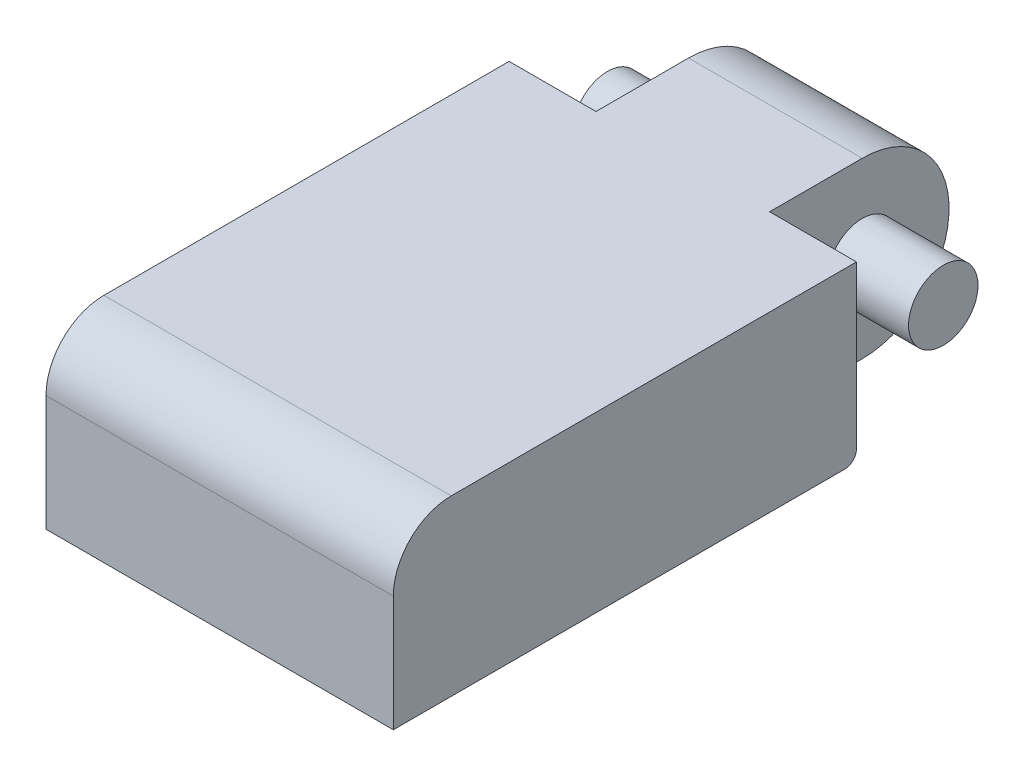
ISO-10303-21;
HEADER;
FILE_DESCRIPTION(('STEP AP214'),'2;1');
FILE_NAME('part.step','',(''),(''),'','','');
FILE_SCHEMA(('AUTOMOTIVE_DESIGN { 1 0 10303 214 1 1 1 1 }'));
ENDSEC;
DATA;
#1=APPLICATION_CONTEXT('core data for automotive mechanical design processes');
#2=APPLICATION_PROTOCOL_DEFINITION('international standard','automotive_design',2000,#1);
#3=PRODUCT_CONTEXT('',#1,'mechanical');
#4=PRODUCT('Part','Part','',(#3));
#5=PRODUCT_RELATED_PRODUCT_CATEGORY('part','',(#4));
#6=PRODUCT_DEFINITION_FORMATION('','',#4);
#7=PRODUCT_DEFINITION_CONTEXT('part definition',#1,'design');
#8=PRODUCT_DEFINITION('design','',#6,#7);
#9=PRODUCT_DEFINITION_SHAPE('','',#8);
#10=(LENGTH_UNIT() NAMED_UNIT(*) SI_UNIT(.MILLI.,.METRE.));
#11=(NAMED_UNIT(*) PLANE_ANGLE_UNIT() SI_UNIT($,.RADIAN.));
#12=(NAMED_UNIT(*) SI_UNIT($,.STERADIAN.) SOLID_ANGLE_UNIT());
#13=UNCERTAINTY_MEASURE_WITH_UNIT(LENGTH_MEASURE(1.E-05),#10,'distance_accuracy_value','');
#14=(GEOMETRIC_REPRESENTATION_CONTEXT(3) GLOBAL_UNCERTAINTY_ASSIGNED_CONTEXT((#13)) GLOBAL_UNIT_ASSIGNED_CONTEXT((#10,
#11,#12)) REPRESENTATION_CONTEXT('',''));
#15=CARTESIAN_POINT('',(0.,0.,0.));
#16=DIRECTION('',(0.,0.,1.));
#17=DIRECTION('',(1.,0.,0.));
#18=AXIS2_PLACEMENT_3D('',#15,#16,#17);
#19=CARTESIAN_POINT('',(0.,0.,0.));
#20=DIRECTION('',(0.,0.,1.));
#21=DIRECTION('',(1.,0.,0.));
#22=AXIS2_PLACEMENT_3D('',#19,#20,#21);
#23=PLANE('',#22);
#24=DIRECTION('',(0.,1.,0.));
#25=VECTOR('',#24,1.);
#26=CARTESIAN_POINT('',(15.,7.5,0.));
#27=LINE('',#26,#25);
#28=CARTESIAN_POINT('',(15.,-6.5,0.));
#29=VERTEX_POINT('',#28);
#30=CARTESIAN_POINT('',(15.,7.5,0.));
#31=VERTEX_POINT('',#30);
#32=EDGE_CURVE('E143',#29,#31,#27,.T.);
#33=ORIENTED_EDGE('',*,*,#32,.F.);
#34=DIRECTION('',(1.,0.,0.));
#35=VECTOR('',#34,1.);
#36=CARTESIAN_POINT('',(0.,-6.5,0.));
#37=LINE('',#36,#35);
#38=CARTESIAN_POINT('',(7.5,-6.5,0.));
#39=VERTEX_POINT('',#38);
#40=EDGE_CURVE('E54',#29,#39,#37,.F.);
#41=ORIENTED_EDGE('',*,*,#40,.T.);
#42=DIRECTION('',(0.,-1.,0.));
#43=VECTOR('',#42,1.);
#44=CARTESIAN_POINT('',(7.5,7.5,0.));
#45=LINE('',#44,#43);
#46=CARTESIAN_POINT('',(7.5,7.5,0.));
#47=VERTEX_POINT('',#46);
#48=EDGE_CURVE('E132',#47,#39,#45,.T.);
#49=ORIENTED_EDGE('',*,*,#48,.F.);
#50=DIRECTION('',(-1.,0.,0.));
#51=VECTOR('',#50,1.);
#52=CARTESIAN_POINT('',(-15.,7.5,0.));
#53=LINE('',#52,#51);
#54=EDGE_CURVE('E187',#31,#47,#53,.T.);
#55=ORIENTED_EDGE('',*,*,#54,.F.);
#56=EDGE_LOOP('',(#33,#41,#49,#55));
#57=FACE_BOUND('',#56,.T.);
#58=ADVANCED_FACE('F38',(#57),#23,.F.);
#59=CARTESIAN_POINT('',(15.,7.5,40.));
#60=DIRECTION('',(-1.,0.,0.));
#61=DIRECTION('',(0.,-1.,0.));
#62=AXIS2_PLACEMENT_3D('',#59,#60,#61);
#63=PLANE('',#62);
#64=DIRECTION('',(0.,0.,-1.));
#65=VECTOR('',#64,1.);
#66=CARTESIAN_POINT('',(15.,-7.5,40.));
#67=LINE('',#66,#65);
#68=CARTESIAN_POINT('',(15.,-7.5,40.));
#69=VERTEX_POINT('',#68);
#70=CARTESIAN_POINT('',(15.,-7.5,1.));
#71=VERTEX_POINT('',#70);
#72=EDGE_CURVE('E183',#69,#71,#67,.T.);
#73=ORIENTED_EDGE('',*,*,#72,.T.);
#74=CARTESIAN_POINT('',(15.,-6.5,1.));
#75=DIRECTION('',(-1.,0.,0.));
#76=DIRECTION('',(0.,-1.,0.));
#77=AXIS2_PLACEMENT_3D('',#74,#75,#76);
#78=CIRCLE('',#77,1.);
#79=EDGE_CURVE('E62',#71,#29,#78,.F.);
#80=ORIENTED_EDGE('',*,*,#79,.T.);
#81=ORIENTED_EDGE('',*,*,#32,.T.);
#82=DIRECTION('',(0.,0.,-1.));
#83=VECTOR('',#82,1.);
#84=CARTESIAN_POINT('',(15.,7.5,40.));
#85=LINE('',#84,#83);
#86=CARTESIAN_POINT('',(15.,7.5,35.));
#87=VERTEX_POINT('',#86);
#88=EDGE_CURVE('E202',#87,#31,#85,.T.);
#89=ORIENTED_EDGE('',*,*,#88,.F.);
#90=CARTESIAN_POINT('',(15.,2.5,35.));
#91=DIRECTION('',(-1.,0.,0.));
#92=DIRECTION('',(0.,-1.,0.));
#93=AXIS2_PLACEMENT_3D('',#90,#91,#92);
#94=CIRCLE('',#93,5.);
#95=CARTESIAN_POINT('',(15.,2.5,40.));
#96=VERTEX_POINT('',#95);
#97=EDGE_CURVE('E224',#87,#96,#94,.F.);
#98=ORIENTED_EDGE('',*,*,#97,.T.);
#99=DIRECTION('',(0.,1.,0.));
#100=VECTOR('',#99,1.);
#101=CARTESIAN_POINT('',(15.,7.5,40.));
#102=LINE('',#101,#100);
#103=EDGE_CURVE('E172',#69,#96,#102,.T.);
#104=ORIENTED_EDGE('',*,*,#103,.F.);
#105=EDGE_LOOP('',(#73,#80,#81,#89,#98,#104));
#106=FACE_BOUND('',#105,.T.);
#107=ADVANCED_FACE('F275',(#106),#63,.F.);
#108=CARTESIAN_POINT('',(-15.,7.5,40.));
#109=DIRECTION('',(0.,-1.,0.));
#110=DIRECTION('',(0.,0.,-1.));
#111=AXIS2_PLACEMENT_3D('',#108,#109,#110);
#112=PLANE('',#111);
#113=DIRECTION('',(0.,0.,-1.));
#114=VECTOR('',#113,1.);
#115=CARTESIAN_POINT('',(-15.,7.5,40.));
#116=LINE('',#115,#114);
#117=CARTESIAN_POINT('',(-15.,7.5,35.));
#118=VERTEX_POINT('',#117);
#119=CARTESIAN_POINT('',(-15.,7.5,0.));
#120=VERTEX_POINT('',#119);
#121=EDGE_CURVE('E199',#118,#120,#116,.T.);
#122=ORIENTED_EDGE('',*,*,#121,.F.);
#123=DIRECTION('',(-1.,0.,0.));
#124=VECTOR('',#123,1.);
#125=CARTESIAN_POINT('',(15.,7.5,35.));
#126=LINE('',#125,#124);
#127=EDGE_CURVE('E221',#118,#87,#126,.F.);
#128=ORIENTED_EDGE('',*,*,#127,.T.);
#129=ORIENTED_EDGE('',*,*,#88,.T.);
#130=ORIENTED_EDGE('',*,*,#54,.T.);
#131=DIRECTION('',(0.,0.,1.));
#132=VECTOR('',#131,1.);
#133=CARTESIAN_POINT('',(7.5,7.5,0.));
#134=LINE('',#133,#132);
#135=CARTESIAN_POINT('',(7.5,7.5,-8.));
#136=VERTEX_POINT('',#135);
#137=EDGE_CURVE('E150',#136,#47,#134,.T.);
#138=ORIENTED_EDGE('',*,*,#137,.F.);
#139=DIRECTION('',(-1.,0.,0.));
#140=VECTOR('',#139,1.);
#141=CARTESIAN_POINT('',(7.5,7.5,-8.));
#142=LINE('',#141,#140);
#143=CARTESIAN_POINT('',(-7.5,7.5,-8.));
#144=VERTEX_POINT('',#143);
#145=EDGE_CURVE('E144',#136,#144,#142,.T.);
#146=ORIENTED_EDGE('',*,*,#145,.T.);
#147=DIRECTION('',(0.,0.,1.));
#148=VECTOR('',#147,1.);
#149=CARTESIAN_POINT('',(-7.5,7.5,0.));
#150=LINE('',#149,#148);
#151=CARTESIAN_POINT('',(-7.5,7.5,0.));
#152=VERTEX_POINT('',#151);
#153=EDGE_CURVE('E166',#144,#152,#150,.T.);
#154=ORIENTED_EDGE('',*,*,#153,.T.);
#155=EDGE_CURVE('E186',#152,#120,#53,.T.);
#156=ORIENTED_EDGE('',*,*,#155,.T.);
#157=EDGE_LOOP('',(#122,#128,#129,#130,#138,#146,#154,#156));
#158=FACE_BOUND('',#157,.T.);
#159=ADVANCED_FACE('F271',(#158),#112,.F.);
#160=CARTESIAN_POINT('',(-15.,7.5,40.));
#161=DIRECTION('',(1.,0.,0.));
#162=DIRECTION('',(0.,1.,0.));
#163=AXIS2_PLACEMENT_3D('',#160,#161,#162);
#164=PLANE('',#163);
#165=DIRECTION('',(0.,-1.,0.));
#166=VECTOR('',#165,1.);
#167=CARTESIAN_POINT('',(-15.,7.5,0.));
#168=LINE('',#167,#166);
#169=CARTESIAN_POINT('',(-15.,-6.5,0.));
#170=VERTEX_POINT('',#169);
#171=EDGE_CURVE('E177',#120,#170,#168,.T.);
#172=ORIENTED_EDGE('',*,*,#171,.T.);
#173=CARTESIAN_POINT('',(-15.,-6.5,1.));
#174=DIRECTION('',(1.,0.,0.));
#175=DIRECTION('',(0.,1.,0.));
#176=AXIS2_PLACEMENT_3D('',#173,#174,#175);
#177=CIRCLE('',#176,1.);
#178=CARTESIAN_POINT('',(-15.,-7.5,1.));
#179=VERTEX_POINT('',#178);
#180=EDGE_CURVE('E236',#170,#179,#177,.F.);
#181=ORIENTED_EDGE('',*,*,#180,.T.);
#182=DIRECTION('',(0.,0.,-1.));
#183=VECTOR('',#182,1.);
#184=CARTESIAN_POINT('',(-15.,-7.5,40.));
#185=LINE('',#184,#183);
#186=CARTESIAN_POINT('',(-15.,-7.5,40.));
#187=VERTEX_POINT('',#186);
#188=EDGE_CURVE('E196',#187,#179,#185,.T.);
#189=ORIENTED_EDGE('',*,*,#188,.F.);
#190=DIRECTION('',(0.,-1.,0.));
#191=VECTOR('',#190,1.);
#192=CARTESIAN_POINT('',(-15.,7.5,40.));
#193=LINE('',#192,#191);
#194=CARTESIAN_POINT('',(-15.,2.5,40.));
#195=VERTEX_POINT('',#194);
#196=EDGE_CURVE('E176',#195,#187,#193,.T.);
#197=ORIENTED_EDGE('',*,*,#196,.F.);
#198=CARTESIAN_POINT('',(-15.,2.5,35.));
#199=DIRECTION('',(1.,0.,0.));
#200=DIRECTION('',(0.,1.,0.));
#201=AXIS2_PLACEMENT_3D('',#198,#199,#200);
#202=CIRCLE('',#201,5.);
#203=EDGE_CURVE('E218',#195,#118,#202,.F.);
#204=ORIENTED_EDGE('',*,*,#203,.T.);
#205=ORIENTED_EDGE('',*,*,#121,.T.);
#206=EDGE_LOOP('',(#172,#181,#189,#197,#204,#205));
#207=FACE_BOUND('',#206,.T.);
#208=ADVANCED_FACE('F259',(#207),#164,.F.);
#209=CARTESIAN_POINT('',(-15.,-7.5,40.));
#210=DIRECTION('',(0.,1.,0.));
#211=DIRECTION('',(0.,0.,1.));
#212=AXIS2_PLACEMENT_3D('',#209,#210,#211);
#213=PLANE('',#212);
#214=ORIENTED_EDGE('',*,*,#188,.T.);
#215=DIRECTION('',(1.,0.,0.));
#216=VECTOR('',#215,1.);
#217=CARTESIAN_POINT('',(-15.,-7.5,1.));
#218=LINE('',#217,#216);
#219=CARTESIAN_POINT('',(-7.5,-7.5,1.));
#220=VERTEX_POINT('',#219);
#221=EDGE_CURVE('E230',#179,#220,#218,.T.);
#222=ORIENTED_EDGE('',*,*,#221,.T.);
#223=DIRECTION('',(0.,0.,-1.));
#224=VECTOR('',#223,1.);
#225=CARTESIAN_POINT('',(-7.5,-7.5,-8.));
#226=LINE('',#225,#224);
#227=CARTESIAN_POINT('',(-7.5,-7.5,-8.));
#228=VERTEX_POINT('',#227);
#229=EDGE_CURVE('E139',#220,#228,#226,.T.);
#230=ORIENTED_EDGE('',*,*,#229,.T.);
#231=DIRECTION('',(-1.,0.,0.));
#232=VECTOR('',#231,1.);
#233=CARTESIAN_POINT('',(7.5,-7.5,-8.));
#234=LINE('',#233,#232);
#235=CARTESIAN_POINT('',(7.5,-7.5,-8.));
#236=VERTEX_POINT('',#235);
#237=EDGE_CURVE('E135',#236,#228,#234,.T.);
#238=ORIENTED_EDGE('',*,*,#237,.F.);
#239=DIRECTION('',(0.,0.,-1.));
#240=VECTOR('',#239,1.);
#241=CARTESIAN_POINT('',(7.5,-7.5,-8.));
#242=LINE('',#241,#240);
#243=CARTESIAN_POINT('',(7.5,-7.5,1.));
#244=VERTEX_POINT('',#243);
#245=EDGE_CURVE('E120',#244,#236,#242,.T.);
#246=ORIENTED_EDGE('',*,*,#245,.F.);
#247=DIRECTION('',(1.,0.,0.));
#248=VECTOR('',#247,1.);
#249=CARTESIAN_POINT('',(-15.,-7.5,1.));
#250=LINE('',#249,#248);
#251=EDGE_CURVE('E227',#244,#71,#250,.T.);
#252=ORIENTED_EDGE('',*,*,#251,.T.);
#253=ORIENTED_EDGE('',*,*,#72,.F.);
#254=DIRECTION('',(1.,0.,0.));
#255=VECTOR('',#254,1.);
#256=CARTESIAN_POINT('',(-15.,-7.5,40.));
#257=LINE('',#256,#255);
#258=EDGE_CURVE('E180',#187,#69,#257,.T.);
#259=ORIENTED_EDGE('',*,*,#258,.F.);
#260=EDGE_LOOP('',(#214,#222,#230,#238,#246,#252,#253,#259));
#261=FACE_BOUND('',#260,.T.);
#262=ADVANCED_FACE('F137',(#261),#213,.F.);
#263=CARTESIAN_POINT('',(0.,0.,40.));
#264=DIRECTION('',(0.,0.,1.));
#265=DIRECTION('',(1.,0.,0.));
#266=AXIS2_PLACEMENT_3D('',#263,#264,#265);
#267=PLANE('',#266);
#268=ORIENTED_EDGE('',*,*,#103,.T.);
#269=DIRECTION('',(-1.,0.,0.));
#270=VECTOR('',#269,1.);
#271=CARTESIAN_POINT('',(-15.,2.5,40.));
#272=LINE('',#271,#270);
#273=EDGE_CURVE('E214',#96,#195,#272,.T.);
#274=ORIENTED_EDGE('',*,*,#273,.T.);
#275=ORIENTED_EDGE('',*,*,#196,.T.);
#276=ORIENTED_EDGE('',*,*,#258,.T.);
#277=EDGE_LOOP('',(#268,#274,#275,#276));
#278=FACE_BOUND('',#277,.T.);
#279=ADVANCED_FACE('F265',(#278),#267,.T.);
#280=DIRECTION('',(0.,-1.,0.));
#281=VECTOR('',#280,1.);
#282=CARTESIAN_POINT('',(-7.5,7.5,0.));
#283=LINE('',#282,#281);
#284=CARTESIAN_POINT('',(-7.5,-6.5,0.));
#285=VERTEX_POINT('',#284);
#286=EDGE_CURVE('E156',#152,#285,#283,.T.);
#287=ORIENTED_EDGE('',*,*,#286,.T.);
#288=DIRECTION('',(1.,0.,0.));
#289=VECTOR('',#288,1.);
#290=CARTESIAN_POINT('',(0.,-6.5,0.));
#291=LINE('',#290,#289);
#292=EDGE_CURVE('E233',#285,#170,#291,.F.);
#293=ORIENTED_EDGE('',*,*,#292,.T.);
#294=ORIENTED_EDGE('',*,*,#171,.F.);
#295=ORIENTED_EDGE('',*,*,#155,.F.);
#296=EDGE_LOOP('',(#287,#293,#294,#295));
#297=FACE_BOUND('',#296,.T.);
#298=ADVANCED_FACE('F252',(#297),#23,.F.);
#299=CARTESIAN_POINT('',(7.5,0.,-8.));
#300=DIRECTION('',(-1.,0.,0.));
#301=DIRECTION('',(0.,0.,1.));
#302=AXIS2_PLACEMENT_3D('',#299,#300,#301);
#303=CYLINDRICAL_SURFACE('',#302,7.5);
#304=CARTESIAN_POINT('',(-7.5,0.,-8.));
#305=DIRECTION('',(1.,0.,0.));
#306=DIRECTION('',(0.,0.,1.));
#307=AXIS2_PLACEMENT_3D('',#304,#305,#306);
#308=CIRCLE('',#307,7.5);
#309=EDGE_CURVE('E163',#228,#144,#308,.T.);
#310=ORIENTED_EDGE('',*,*,#309,.T.);
#311=ORIENTED_EDGE('',*,*,#145,.F.);
#312=CARTESIAN_POINT('',(7.5,0.,-8.));
#313=DIRECTION('',(1.,0.,0.));
#314=DIRECTION('',(0.,0.,1.));
#315=AXIS2_PLACEMENT_3D('',#312,#313,#314);
#316=CIRCLE('',#315,7.5);
#317=EDGE_CURVE('E125',#236,#136,#316,.T.);
#318=ORIENTED_EDGE('',*,*,#317,.F.);
#319=ORIENTED_EDGE('',*,*,#237,.T.);
#320=EDGE_LOOP('',(#310,#311,#318,#319));
#321=FACE_BOUND('',#320,.T.);
#322=ADVANCED_FACE('F146',(#321),#303,.T.);
#323=CARTESIAN_POINT('',(7.5,0.,-8.));
#324=DIRECTION('',(-1.,0.,0.));
#325=DIRECTION('',(0.,0.,1.));
#326=AXIS2_PLACEMENT_3D('',#323,#324,#325);
#327=PLANE('',#326);
#328=CARTESIAN_POINT('',(7.5,0.,-8.));
#329=DIRECTION('',(-1.,0.,0.));
#330=DIRECTION('',(0.,0.,1.));
#331=AXIS2_PLACEMENT_3D('',#328,#329,#330);
#332=CIRCLE('',#331,3.);
#333=CARTESIAN_POINT('',(7.5,0.,-5.));
#334=VERTEX_POINT('',#333);
#335=EDGE_CURVE('E206',#334,#334,#332,.F.);
#336=ORIENTED_EDGE('',*,*,#335,.F.);
#337=EDGE_LOOP('',(#336));
#338=FACE_BOUND('',#337,.T.);
#339=ORIENTED_EDGE('',*,*,#48,.T.);
#340=CARTESIAN_POINT('',(7.5,-6.5,1.));
#341=DIRECTION('',(-1.,0.,0.));
#342=DIRECTION('',(0.,0.,1.));
#343=AXIS2_PLACEMENT_3D('',#340,#341,#342);
#344=CIRCLE('',#343,1.);
#345=EDGE_CURVE('E11',#39,#244,#344,.T.);
#346=ORIENTED_EDGE('',*,*,#345,.T.);
#347=ORIENTED_EDGE('',*,*,#245,.T.);
#348=ORIENTED_EDGE('',*,*,#317,.T.);
#349=ORIENTED_EDGE('',*,*,#137,.T.);
#350=EDGE_LOOP('',(#339,#346,#347,#348,#349));
#351=FACE_BOUND('',#350,.T.);
#352=ADVANCED_FACE('F122',(#338,#351),#327,.F.);
#353=CARTESIAN_POINT('',(-7.5,0.,-8.));
#354=DIRECTION('',(-1.,0.,0.));
#355=DIRECTION('',(0.,0.,1.));
#356=AXIS2_PLACEMENT_3D('',#353,#354,#355);
#357=PLANE('',#356);
#358=CARTESIAN_POINT('',(-7.5,0.,-8.));
#359=DIRECTION('',(-1.,0.,0.));
#360=DIRECTION('',(0.,0.,1.));
#361=AXIS2_PLACEMENT_3D('',#358,#359,#360);
#362=CIRCLE('',#361,3.);
#363=CARTESIAN_POINT('',(-7.5,0.,-5.));
#364=VERTEX_POINT('',#363);
#365=EDGE_CURVE('E210',#364,#364,#362,.T.);
#366=ORIENTED_EDGE('',*,*,#365,.F.);
#367=EDGE_LOOP('',(#366));
#368=FACE_BOUND('',#367,.T.);
#369=ORIENTED_EDGE('',*,*,#286,.F.);
#370=ORIENTED_EDGE('',*,*,#153,.F.);
#371=ORIENTED_EDGE('',*,*,#309,.F.);
#372=ORIENTED_EDGE('',*,*,#229,.F.);
#373=CARTESIAN_POINT('',(-7.5,-6.5,1.));
#374=DIRECTION('',(-1.,0.,0.));
#375=DIRECTION('',(0.,0.,1.));
#376=AXIS2_PLACEMENT_3D('',#373,#374,#375);
#377=CIRCLE('',#376,1.);
#378=EDGE_CURVE('E47',#220,#285,#377,.F.);
#379=ORIENTED_EDGE('',*,*,#378,.T.);
#380=EDGE_LOOP('',(#369,#370,#371,#372,#379));
#381=FACE_BOUND('',#380,.T.);
#382=ADVANCED_FACE('F246',(#368,#381),#357,.T.);
#383=CARTESIAN_POINT('',(14.5,0.,-8.));
#384=DIRECTION('',(-1.,0.,0.));
#385=DIRECTION('',(0.,0.,1.));
#386=AXIS2_PLACEMENT_3D('',#383,#384,#385);
#387=CYLINDRICAL_SURFACE('',#386,3.);
#388=CARTESIAN_POINT('',(14.5,0.,-8.));
#389=DIRECTION('',(1.,0.,0.));
#390=DIRECTION('',(0.,0.,-1.));
#391=AXIS2_PLACEMENT_3D('',#388,#389,#390);
#392=CIRCLE('',#391,3.);
#393=CARTESIAN_POINT('',(14.5,0.,-11.));
#394=VERTEX_POINT('',#393);
#395=EDGE_CURVE('E160',#394,#394,#392,.T.);
#396=ORIENTED_EDGE('',*,*,#395,.F.);
#397=EDGE_LOOP('',(#396));
#398=FACE_BOUND('',#397,.T.);
#399=ORIENTED_EDGE('',*,*,#335,.T.);
#400=EDGE_LOOP('',(#399));
#401=FACE_BOUND('',#400,.T.);
#402=ADVANCED_FACE('F323',(#398,#401),#387,.T.);
#403=CARTESIAN_POINT('',(14.5,0.,-8.));
#404=DIRECTION('',(1.,0.,0.));
#405=DIRECTION('',(0.,0.,-1.));
#406=AXIS2_PLACEMENT_3D('',#403,#404,#405);
#407=PLANE('',#406);
#408=ORIENTED_EDGE('',*,*,#395,.T.);
#409=EDGE_LOOP('',(#408));
#410=FACE_BOUND('',#409,.T.);
#411=ADVANCED_FACE('F298',(#410),#407,.T.);
#412=CARTESIAN_POINT('',(-14.5,0.,-8.));
#413=DIRECTION('',(1.,0.,0.));
#414=DIRECTION('',(0.,0.,-1.));
#415=AXIS2_PLACEMENT_3D('',#412,#413,#414);
#416=CYLINDRICAL_SURFACE('',#415,3.);
#417=CARTESIAN_POINT('',(-14.5,0.,-8.));
#418=DIRECTION('',(1.,0.,0.));
#419=DIRECTION('',(0.,0.,-1.));
#420=AXIS2_PLACEMENT_3D('',#417,#418,#419);
#421=CIRCLE('',#420,3.);
#422=CARTESIAN_POINT('',(-14.5,0.,-11.));
#423=VERTEX_POINT('',#422);
#424=EDGE_CURVE('E282',#423,#423,#421,.T.);
#425=ORIENTED_EDGE('',*,*,#424,.T.);
#426=EDGE_LOOP('',(#425));
#427=FACE_BOUND('',#426,.T.);
#428=ORIENTED_EDGE('',*,*,#365,.T.);
#429=EDGE_LOOP('',(#428));
#430=FACE_BOUND('',#429,.T.);
#431=ADVANCED_FACE('F287',(#427,#430),#416,.T.);
#432=CARTESIAN_POINT('',(-14.5,0.,-8.));
#433=DIRECTION('',(-1.,0.,0.));
#434=DIRECTION('',(0.,0.,-1.));
#435=AXIS2_PLACEMENT_3D('',#432,#433,#434);
#436=PLANE('',#435);
#437=ORIENTED_EDGE('',*,*,#424,.F.);
#438=EDGE_LOOP('',(#437));
#439=FACE_BOUND('',#438,.T.);
#440=ADVANCED_FACE('F290',(#439),#436,.T.);
#441=CARTESIAN_POINT('',(0.,2.5,35.));
#442=DIRECTION('',(1.,0.,0.));
#443=DIRECTION('',(0.,0.,-1.));
#444=AXIS2_PLACEMENT_3D('',#441,#442,#443);
#445=CYLINDRICAL_SURFACE('',#444,5.);
#446=ORIENTED_EDGE('',*,*,#97,.F.);
#447=ORIENTED_EDGE('',*,*,#127,.F.);
#448=ORIENTED_EDGE('',*,*,#203,.F.);
#449=ORIENTED_EDGE('',*,*,#273,.F.);
#450=EDGE_LOOP('',(#446,#447,#448,#449));
#451=FACE_BOUND('',#450,.T.);
#452=ADVANCED_FACE('F274',(#451),#445,.T.);
#453=CARTESIAN_POINT('',(-15.,-6.5,1.));
#454=DIRECTION('',(1.,0.,0.));
#455=DIRECTION('',(0.,0.,-1.));
#456=AXIS2_PLACEMENT_3D('',#453,#454,#455);
#457=CYLINDRICAL_SURFACE('',#456,1.);
#458=ORIENTED_EDGE('',*,*,#180,.F.);
#459=ORIENTED_EDGE('',*,*,#292,.F.);
#460=ORIENTED_EDGE('',*,*,#378,.F.);
#461=ORIENTED_EDGE('',*,*,#221,.F.);
#462=EDGE_LOOP('',(#458,#459,#460,#461));
#463=FACE_BOUND('',#462,.T.);
#464=ADVANCED_FACE('F256',(#463),#457,.T.);
#465=CARTESIAN_POINT('',(-15.,-6.5,1.));
#466=DIRECTION('',(1.,0.,0.));
#467=DIRECTION('',(0.,0.,-1.));
#468=AXIS2_PLACEMENT_3D('',#465,#466,#467);
#469=CYLINDRICAL_SURFACE('',#468,1.);
#470=ORIENTED_EDGE('',*,*,#345,.F.);
#471=ORIENTED_EDGE('',*,*,#40,.F.);
#472=ORIENTED_EDGE('',*,*,#79,.F.);
#473=ORIENTED_EDGE('',*,*,#251,.F.);
#474=EDGE_LOOP('',(#470,#471,#472,#473));
#475=FACE_BOUND('',#474,.T.);
#476=ADVANCED_FACE('F40',(#475),#469,.T.);
#477=CLOSED_SHELL('',(#58,#107,#159,#208,#262,#279,#298,#322,#352,#382,#402,#411,#431,#440,#452,
#464,#476));
#478=MANIFOLD_SOLID_BREP('B2',#477);
#479=ADVANCED_BREP_SHAPE_REPRESENTATION('',(#18,#478),#14);
#480=SHAPE_DEFINITION_REPRESENTATION(#9,#479);
ENDSEC;
END-ISO-10303-21;
